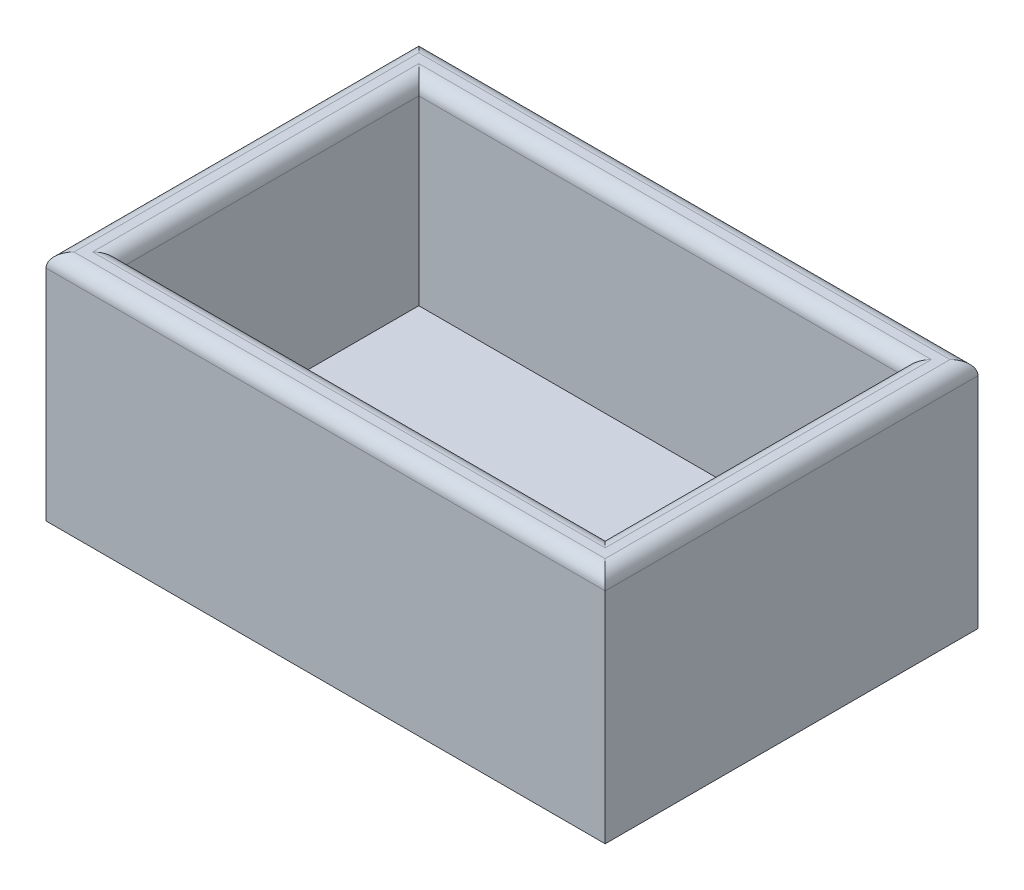
ISO-10303-21;
HEADER;
FILE_DESCRIPTION(('STEP AP214'),'2;1');
FILE_NAME('part.step','',(''),(''),'','','');
FILE_SCHEMA(('AUTOMOTIVE_DESIGN { 1 0 10303 214 1 1 1 1 }'));
ENDSEC;
DATA;
#1=APPLICATION_CONTEXT('core data for automotive mechanical design processes');
#2=APPLICATION_PROTOCOL_DEFINITION('international standard','automotive_design',2000,#1);
#3=PRODUCT_CONTEXT('',#1,'mechanical');
#4=PRODUCT('Part','Part','',(#3));
#5=PRODUCT_RELATED_PRODUCT_CATEGORY('part','',(#4));
#6=PRODUCT_DEFINITION_FORMATION('','',#4);
#7=PRODUCT_DEFINITION_CONTEXT('part definition',#1,'design');
#8=PRODUCT_DEFINITION('design','',#6,#7);
#9=PRODUCT_DEFINITION_SHAPE('','',#8);
#10=(LENGTH_UNIT() NAMED_UNIT(*) SI_UNIT(.MILLI.,.METRE.));
#11=(NAMED_UNIT(*) PLANE_ANGLE_UNIT() SI_UNIT($,.RADIAN.));
#12=(NAMED_UNIT(*) SI_UNIT($,.STERADIAN.) SOLID_ANGLE_UNIT());
#13=UNCERTAINTY_MEASURE_WITH_UNIT(LENGTH_MEASURE(1.E-05),#10,'distance_accuracy_value','');
#14=(GEOMETRIC_REPRESENTATION_CONTEXT(3) GLOBAL_UNCERTAINTY_ASSIGNED_CONTEXT((#13)) GLOBAL_UNIT_ASSIGNED_CONTEXT((#10,
#11,#12)) REPRESENTATION_CONTEXT('',''));
#15=CARTESIAN_POINT('',(0.,0.,0.));
#16=DIRECTION('',(0.,0.,1.));
#17=DIRECTION('',(1.,0.,0.));
#18=AXIS2_PLACEMENT_3D('',#15,#16,#17);
#19=CARTESIAN_POINT('',(-60.,50.,40.));
#20=DIRECTION('',(1.,0.,0.));
#21=DIRECTION('',(0.,0.,-1.));
#22=AXIS2_PLACEMENT_3D('',#19,#20,#21);
#23=PLANE('',#22);
#24=DIRECTION('',(0.,-1.,0.));
#25=VECTOR('',#24,1.);
#26=CARTESIAN_POINT('',(-60.,50.,40.));
#27=LINE('',#26,#25);
#28=CARTESIAN_POINT('',(-60.,47.,40.));
#29=VERTEX_POINT('',#28);
#30=CARTESIAN_POINT('',(-60.,0.,40.));
#31=VERTEX_POINT('',#30);
#32=EDGE_CURVE('E217',#29,#31,#27,.T.);
#33=ORIENTED_EDGE('',*,*,#32,.F.);
#34=DIRECTION('',(0.,0.,1.));
#35=VECTOR('',#34,1.);
#36=CARTESIAN_POINT('',(-60.,47.,40.));
#37=LINE('',#36,#35);
#38=CARTESIAN_POINT('',(-60.,47.,-40.));
#39=VERTEX_POINT('',#38);
#40=EDGE_CURVE('E62',#29,#39,#37,.F.);
#41=ORIENTED_EDGE('',*,*,#40,.T.);
#42=DIRECTION('',(0.,-1.,0.));
#43=VECTOR('',#42,1.);
#44=CARTESIAN_POINT('',(-60.,50.,-40.));
#45=LINE('',#44,#43);
#46=CARTESIAN_POINT('',(-60.,0.,-40.));
#47=VERTEX_POINT('',#46);
#48=EDGE_CURVE('E208',#39,#47,#45,.T.);
#49=ORIENTED_EDGE('',*,*,#48,.T.);
#50=DIRECTION('',(0.,0.,1.));
#51=VECTOR('',#50,1.);
#52=CARTESIAN_POINT('',(-60.,0.,40.));
#53=LINE('',#52,#51);
#54=EDGE_CURVE('E187',#47,#31,#53,.T.);
#55=ORIENTED_EDGE('',*,*,#54,.T.);
#56=EDGE_LOOP('',(#33,#41,#49,#55));
#57=FACE_BOUND('',#56,.T.);
#58=ADVANCED_FACE('F51',(#57),#23,.F.);
#59=CARTESIAN_POINT('',(60.,50.,40.));
#60=DIRECTION('',(0.,0.,-1.));
#61=DIRECTION('',(-1.,0.,0.));
#62=AXIS2_PLACEMENT_3D('',#59,#60,#61);
#63=PLANE('',#62);
#64=DIRECTION('',(0.,-1.,0.));
#65=VECTOR('',#64,1.);
#66=CARTESIAN_POINT('',(60.,50.,40.));
#67=LINE('',#66,#65);
#68=CARTESIAN_POINT('',(60.,47.,40.));
#69=VERTEX_POINT('',#68);
#70=CARTESIAN_POINT('',(60.,0.,40.));
#71=VERTEX_POINT('',#70);
#72=EDGE_CURVE('E214',#69,#71,#67,.T.);
#73=ORIENTED_EDGE('',*,*,#72,.F.);
#74=DIRECTION('',(1.,0.,0.));
#75=VECTOR('',#74,1.);
#76=CARTESIAN_POINT('',(60.,47.,40.));
#77=LINE('',#76,#75);
#78=EDGE_CURVE('E70',#69,#29,#77,.F.);
#79=ORIENTED_EDGE('',*,*,#78,.T.);
#80=ORIENTED_EDGE('',*,*,#32,.T.);
#81=DIRECTION('',(1.,0.,0.));
#82=VECTOR('',#81,1.);
#83=CARTESIAN_POINT('',(60.,0.,40.));
#84=LINE('',#83,#82);
#85=EDGE_CURVE('E197',#31,#71,#84,.T.);
#86=ORIENTED_EDGE('',*,*,#85,.T.);
#87=EDGE_LOOP('',(#73,#79,#80,#86));
#88=FACE_BOUND('',#87,.T.);
#89=ADVANCED_FACE('F323',(#88),#63,.F.);
#90=CARTESIAN_POINT('',(60.,50.,-40.));
#91=DIRECTION('',(-1.,0.,0.));
#92=DIRECTION('',(0.,0.,1.));
#93=AXIS2_PLACEMENT_3D('',#90,#91,#92);
#94=PLANE('',#93);
#95=DIRECTION('',(0.,-1.,0.));
#96=VECTOR('',#95,1.);
#97=CARTESIAN_POINT('',(60.,50.,-40.));
#98=LINE('',#97,#96);
#99=CARTESIAN_POINT('',(60.,47.,-40.));
#100=VERTEX_POINT('',#99);
#101=CARTESIAN_POINT('',(60.,0.,-40.));
#102=VERTEX_POINT('',#101);
#103=EDGE_CURVE('E211',#100,#102,#98,.T.);
#104=ORIENTED_EDGE('',*,*,#103,.F.);
#105=DIRECTION('',(0.,0.,-1.));
#106=VECTOR('',#105,1.);
#107=CARTESIAN_POINT('',(60.,47.,-40.));
#108=LINE('',#107,#106);
#109=EDGE_CURVE('E11',#100,#69,#108,.F.);
#110=ORIENTED_EDGE('',*,*,#109,.T.);
#111=ORIENTED_EDGE('',*,*,#72,.T.);
#112=DIRECTION('',(0.,0.,-1.));
#113=VECTOR('',#112,1.);
#114=CARTESIAN_POINT('',(60.,0.,-40.));
#115=LINE('',#114,#113);
#116=EDGE_CURVE('E201',#71,#102,#115,.T.);
#117=ORIENTED_EDGE('',*,*,#116,.T.);
#118=EDGE_LOOP('',(#104,#110,#111,#117));
#119=FACE_BOUND('',#118,.T.);
#120=ADVANCED_FACE('F318',(#119),#94,.F.);
#121=CARTESIAN_POINT('',(-60.,50.,-40.));
#122=DIRECTION('',(0.,0.,1.));
#123=DIRECTION('',(1.,0.,0.));
#124=AXIS2_PLACEMENT_3D('',#121,#122,#123);
#125=PLANE('',#124);
#126=ORIENTED_EDGE('',*,*,#48,.F.);
#127=DIRECTION('',(-1.,0.,0.));
#128=VECTOR('',#127,1.);
#129=CARTESIAN_POINT('',(-60.,47.,-40.));
#130=LINE('',#129,#128);
#131=EDGE_CURVE('E257',#39,#100,#130,.F.);
#132=ORIENTED_EDGE('',*,*,#131,.T.);
#133=ORIENTED_EDGE('',*,*,#103,.T.);
#134=DIRECTION('',(-1.,0.,0.));
#135=VECTOR('',#134,1.);
#136=CARTESIAN_POINT('',(-60.,0.,-40.));
#137=LINE('',#136,#135);
#138=EDGE_CURVE('E204',#102,#47,#137,.T.);
#139=ORIENTED_EDGE('',*,*,#138,.T.);
#140=EDGE_LOOP('',(#126,#132,#133,#139));
#141=FACE_BOUND('',#140,.T.);
#142=ADVANCED_FACE('F301',(#141),#125,.F.);
#143=CARTESIAN_POINT('',(0.,50.,0.));
#144=DIRECTION('',(0.,-1.,0.));
#145=DIRECTION('',(0.,0.,-1.));
#146=AXIS2_PLACEMENT_3D('',#143,#144,#145);
#147=PLANE('',#146);
#148=DIRECTION('',(1.,0.,0.));
#149=VECTOR('',#148,1.);
#150=CARTESIAN_POINT('',(0.,50.,35.));
#151=LINE('',#150,#149);
#152=CARTESIAN_POINT('',(55.,50.,35.));
#153=VERTEX_POINT('',#152);
#154=CARTESIAN_POINT('',(-55.,50.,35.));
#155=VERTEX_POINT('',#154);
#156=EDGE_CURVE('E240',#153,#155,#151,.F.);
#157=ORIENTED_EDGE('',*,*,#156,.T.);
#158=DIRECTION('',(0.,0.,1.));
#159=VECTOR('',#158,1.);
#160=CARTESIAN_POINT('',(-55.,50.,0.));
#161=LINE('',#160,#159);
#162=CARTESIAN_POINT('',(-55.,50.,-35.));
#163=VERTEX_POINT('',#162);
#164=EDGE_CURVE('E246',#155,#163,#161,.F.);
#165=ORIENTED_EDGE('',*,*,#164,.T.);
#166=DIRECTION('',(-1.,0.,0.));
#167=VECTOR('',#166,1.);
#168=CARTESIAN_POINT('',(0.,50.,-35.));
#169=LINE('',#168,#167);
#170=CARTESIAN_POINT('',(55.,50.,-35.));
#171=VERTEX_POINT('',#170);
#172=EDGE_CURVE('E243',#163,#171,#169,.F.);
#173=ORIENTED_EDGE('',*,*,#172,.T.);
#174=DIRECTION('',(0.,0.,-1.));
#175=VECTOR('',#174,1.);
#176=CARTESIAN_POINT('',(55.,50.,0.));
#177=LINE('',#176,#175);
#178=EDGE_CURVE('E237',#171,#153,#177,.F.);
#179=ORIENTED_EDGE('',*,*,#178,.T.);
#180=EDGE_LOOP('',(#157,#165,#173,#179));
#181=FACE_BOUND('',#180,.T.);
#182=DIRECTION('',(-1.,0.,0.));
#183=VECTOR('',#182,1.);
#184=CARTESIAN_POINT('',(0.,50.,-37.));
#185=LINE('',#184,#183);
#186=CARTESIAN_POINT('',(57.,50.,-37.));
#187=VERTEX_POINT('',#186);
#188=CARTESIAN_POINT('',(-57.,50.,-37.));
#189=VERTEX_POINT('',#188);
#190=EDGE_CURVE('E230',#187,#189,#185,.T.);
#191=ORIENTED_EDGE('',*,*,#190,.T.);
#192=DIRECTION('',(0.,0.,1.));
#193=VECTOR('',#192,1.);
#194=CARTESIAN_POINT('',(-57.,50.,0.));
#195=LINE('',#194,#193);
#196=CARTESIAN_POINT('',(-57.,50.,37.));
#197=VERTEX_POINT('',#196);
#198=EDGE_CURVE('E234',#189,#197,#195,.T.);
#199=ORIENTED_EDGE('',*,*,#198,.T.);
#200=DIRECTION('',(1.,0.,0.));
#201=VECTOR('',#200,1.);
#202=CARTESIAN_POINT('',(0.,50.,37.));
#203=LINE('',#202,#201);
#204=CARTESIAN_POINT('',(57.,50.,37.));
#205=VERTEX_POINT('',#204);
#206=EDGE_CURVE('E227',#197,#205,#203,.T.);
#207=ORIENTED_EDGE('',*,*,#206,.T.);
#208=DIRECTION('',(0.,0.,-1.));
#209=VECTOR('',#208,1.);
#210=CARTESIAN_POINT('',(57.,50.,0.));
#211=LINE('',#210,#209);
#212=EDGE_CURVE('E224',#205,#187,#211,.T.);
#213=ORIENTED_EDGE('',*,*,#212,.T.);
#214=EDGE_LOOP('',(#191,#199,#207,#213));
#215=FACE_BOUND('',#214,.T.);
#216=ADVANCED_FACE('F308',(#181,#215),#147,.F.);
#217=CARTESIAN_POINT('',(0.,0.,0.));
#218=DIRECTION('',(0.,-1.,0.));
#219=DIRECTION('',(0.,0.,-1.));
#220=AXIS2_PLACEMENT_3D('',#217,#218,#219);
#221=PLANE('',#220);
#222=ORIENTED_EDGE('',*,*,#54,.F.);
#223=ORIENTED_EDGE('',*,*,#138,.F.);
#224=ORIENTED_EDGE('',*,*,#116,.F.);
#225=ORIENTED_EDGE('',*,*,#85,.F.);
#226=EDGE_LOOP('',(#222,#223,#224,#225));
#227=FACE_BOUND('',#226,.T.);
#228=ADVANCED_FACE('F310',(#227),#221,.T.);
#229=CARTESIAN_POINT('',(-52.,8.,32.));
#230=DIRECTION('',(-1.,0.,0.));
#231=DIRECTION('',(0.,0.,1.));
#232=AXIS2_PLACEMENT_3D('',#229,#230,#231);
#233=PLANE('',#232);
#234=DIRECTION('',(0.,1.,0.));
#235=VECTOR('',#234,1.);
#236=CARTESIAN_POINT('',(-52.,8.,-32.));
#237=LINE('',#236,#235);
#238=CARTESIAN_POINT('',(-52.,8.,-32.));
#239=VERTEX_POINT('',#238);
#240=CARTESIAN_POINT('',(-52.,47.,-32.));
#241=VERTEX_POINT('',#240);
#242=EDGE_CURVE('E184',#239,#241,#237,.T.);
#243=ORIENTED_EDGE('',*,*,#242,.T.);
#244=DIRECTION('',(0.,0.,1.));
#245=VECTOR('',#244,1.);
#246=CARTESIAN_POINT('',(-52.,47.,32.));
#247=LINE('',#246,#245);
#248=CARTESIAN_POINT('',(-52.,47.,32.));
#249=VERTEX_POINT('',#248);
#250=EDGE_CURVE('E151',#241,#249,#247,.T.);
#251=ORIENTED_EDGE('',*,*,#250,.T.);
#252=DIRECTION('',(0.,1.,0.));
#253=VECTOR('',#252,1.);
#254=CARTESIAN_POINT('',(-52.,8.,32.));
#255=LINE('',#254,#253);
#256=CARTESIAN_POINT('',(-52.,8.,32.));
#257=VERTEX_POINT('',#256);
#258=EDGE_CURVE('E143',#257,#249,#255,.T.);
#259=ORIENTED_EDGE('',*,*,#258,.F.);
#260=DIRECTION('',(0.,0.,1.));
#261=VECTOR('',#260,1.);
#262=CARTESIAN_POINT('',(-52.,8.,32.));
#263=LINE('',#262,#261);
#264=EDGE_CURVE('E148',#239,#257,#263,.T.);
#265=ORIENTED_EDGE('',*,*,#264,.F.);
#266=EDGE_LOOP('',(#243,#251,#259,#265));
#267=FACE_BOUND('',#266,.T.);
#268=ADVANCED_FACE('F146',(#267),#233,.F.);
#269=CARTESIAN_POINT('',(-52.,8.,-32.));
#270=DIRECTION('',(0.,0.,-1.));
#271=DIRECTION('',(-1.,0.,0.));
#272=AXIS2_PLACEMENT_3D('',#269,#270,#271);
#273=PLANE('',#272);
#274=DIRECTION('',(0.,1.,0.));
#275=VECTOR('',#274,1.);
#276=CARTESIAN_POINT('',(52.,8.,-32.));
#277=LINE('',#276,#275);
#278=CARTESIAN_POINT('',(52.,8.,-32.));
#279=VERTEX_POINT('',#278);
#280=CARTESIAN_POINT('',(52.,47.,-32.));
#281=VERTEX_POINT('',#280);
#282=EDGE_CURVE('E188',#279,#281,#277,.T.);
#283=ORIENTED_EDGE('',*,*,#282,.T.);
#284=DIRECTION('',(-1.,0.,0.));
#285=VECTOR('',#284,1.);
#286=CARTESIAN_POINT('',(-52.,47.,-32.));
#287=LINE('',#286,#285);
#288=EDGE_CURVE('E220',#281,#241,#287,.T.);
#289=ORIENTED_EDGE('',*,*,#288,.T.);
#290=ORIENTED_EDGE('',*,*,#242,.F.);
#291=DIRECTION('',(-1.,0.,0.));
#292=VECTOR('',#291,1.);
#293=CARTESIAN_POINT('',(-52.,8.,-32.));
#294=LINE('',#293,#292);
#295=EDGE_CURVE('E156',#279,#239,#294,.T.);
#296=ORIENTED_EDGE('',*,*,#295,.F.);
#297=EDGE_LOOP('',(#283,#289,#290,#296));
#298=FACE_BOUND('',#297,.T.);
#299=ADVANCED_FACE('F384',(#298),#273,.F.);
#300=CARTESIAN_POINT('',(52.,8.,-32.));
#301=DIRECTION('',(1.,0.,0.));
#302=DIRECTION('',(0.,0.,-1.));
#303=AXIS2_PLACEMENT_3D('',#300,#301,#302);
#304=PLANE('',#303);
#305=DIRECTION('',(0.,1.,0.));
#306=VECTOR('',#305,1.);
#307=CARTESIAN_POINT('',(52.,8.,32.));
#308=LINE('',#307,#306);
#309=CARTESIAN_POINT('',(52.,8.,32.));
#310=VERTEX_POINT('',#309);
#311=CARTESIAN_POINT('',(52.,47.,32.));
#312=VERTEX_POINT('',#311);
#313=EDGE_CURVE('E155',#310,#312,#308,.T.);
#314=ORIENTED_EDGE('',*,*,#313,.T.);
#315=DIRECTION('',(0.,0.,-1.));
#316=VECTOR('',#315,1.);
#317=CARTESIAN_POINT('',(52.,47.,-32.));
#318=LINE('',#317,#316);
#319=EDGE_CURVE('E254',#312,#281,#318,.T.);
#320=ORIENTED_EDGE('',*,*,#319,.T.);
#321=ORIENTED_EDGE('',*,*,#282,.F.);
#322=DIRECTION('',(0.,0.,-1.));
#323=VECTOR('',#322,1.);
#324=CARTESIAN_POINT('',(52.,8.,-32.));
#325=LINE('',#324,#323);
#326=EDGE_CURVE('E166',#310,#279,#325,.T.);
#327=ORIENTED_EDGE('',*,*,#326,.F.);
#328=EDGE_LOOP('',(#314,#320,#321,#327));
#329=FACE_BOUND('',#328,.T.);
#330=ADVANCED_FACE('F379',(#329),#304,.F.);
#331=CARTESIAN_POINT('',(52.,8.,32.));
#332=DIRECTION('',(0.,0.,1.));
#333=DIRECTION('',(1.,0.,0.));
#334=AXIS2_PLACEMENT_3D('',#331,#332,#333);
#335=PLANE('',#334);
#336=ORIENTED_EDGE('',*,*,#258,.T.);
#337=DIRECTION('',(1.,0.,0.));
#338=VECTOR('',#337,1.);
#339=CARTESIAN_POINT('',(52.,47.,32.));
#340=LINE('',#339,#338);
#341=EDGE_CURVE('E249',#249,#312,#340,.T.);
#342=ORIENTED_EDGE('',*,*,#341,.T.);
#343=ORIENTED_EDGE('',*,*,#313,.F.);
#344=DIRECTION('',(1.,0.,0.));
#345=VECTOR('',#344,1.);
#346=CARTESIAN_POINT('',(52.,8.,32.));
#347=LINE('',#346,#345);
#348=EDGE_CURVE('E159',#257,#310,#347,.T.);
#349=ORIENTED_EDGE('',*,*,#348,.F.);
#350=EDGE_LOOP('',(#336,#342,#343,#349));
#351=FACE_BOUND('',#350,.T.);
#352=ADVANCED_FACE('F160',(#351),#335,.F.);
#353=CARTESIAN_POINT('',(0.,8.,0.));
#354=DIRECTION('',(0.,-1.,0.));
#355=DIRECTION('',(0.,0.,-1.));
#356=AXIS2_PLACEMENT_3D('',#353,#354,#355);
#357=PLANE('',#356);
#358=ORIENTED_EDGE('',*,*,#264,.T.);
#359=ORIENTED_EDGE('',*,*,#348,.T.);
#360=ORIENTED_EDGE('',*,*,#326,.T.);
#361=ORIENTED_EDGE('',*,*,#295,.T.);
#362=EDGE_LOOP('',(#358,#359,#360,#361));
#363=FACE_BOUND('',#362,.T.);
#364=ADVANCED_FACE('F168',(#363),#357,.F.);
#365=CARTESIAN_POINT('',(52.,47.,35.));
#366=DIRECTION('',(1.,0.,0.));
#367=DIRECTION('',(0.,0.,-1.));
#368=AXIS2_PLACEMENT_3D('',#365,#366,#367);
#369=CYLINDRICAL_SURFACE('',#368,3.);
#370=CARTESIAN_POINT('',(-55.,47.,35.));
#371=DIRECTION('',(0.707106781186547,0.,0.707106781186547));
#372=DIRECTION('',(0.707106781186547,0.,-0.707106781186547));
#373=AXIS2_PLACEMENT_3D('',#370,#371,#372);
#374=ELLIPSE('',#373,4.24264068711928,3.);
#375=EDGE_CURVE('E177',#155,#249,#374,.F.);
#376=ORIENTED_EDGE('',*,*,#375,.F.);
#377=ORIENTED_EDGE('',*,*,#156,.F.);
#378=CARTESIAN_POINT('',(55.,47.,35.));
#379=DIRECTION('',(0.707106781186547,0.,-0.707106781186547));
#380=DIRECTION('',(0.707106781186547,0.,0.707106781186547));
#381=AXIS2_PLACEMENT_3D('',#378,#379,#380);
#382=ELLIPSE('',#381,4.24264068711928,3.);
#383=EDGE_CURVE('E171',#312,#153,#382,.T.);
#384=ORIENTED_EDGE('',*,*,#383,.F.);
#385=ORIENTED_EDGE('',*,*,#341,.F.);
#386=EDGE_LOOP('',(#376,#377,#384,#385));
#387=FACE_BOUND('',#386,.T.);
#388=ADVANCED_FACE('F347',(#387),#369,.T.);
#389=CARTESIAN_POINT('',(55.,47.,-32.));
#390=DIRECTION('',(0.,0.,-1.));
#391=DIRECTION('',(-1.,0.,0.));
#392=AXIS2_PLACEMENT_3D('',#389,#390,#391);
#393=CYLINDRICAL_SURFACE('',#392,3.);
#394=ORIENTED_EDGE('',*,*,#383,.T.);
#395=ORIENTED_EDGE('',*,*,#178,.F.);
#396=CARTESIAN_POINT('',(55.,47.,-35.));
#397=DIRECTION('',(-0.707106781186547,0.,-0.707106781186547));
#398=DIRECTION('',(-0.707106781186547,0.,0.707106781186547));
#399=AXIS2_PLACEMENT_3D('',#396,#397,#398);
#400=ELLIPSE('',#399,4.24264068711928,3.);
#401=EDGE_CURVE('E268',#281,#171,#400,.T.);
#402=ORIENTED_EDGE('',*,*,#401,.F.);
#403=ORIENTED_EDGE('',*,*,#319,.F.);
#404=EDGE_LOOP('',(#394,#395,#402,#403));
#405=FACE_BOUND('',#404,.T.);
#406=ADVANCED_FACE('F342',(#405),#393,.T.);
#407=CARTESIAN_POINT('',(-55.,47.,32.));
#408=DIRECTION('',(0.,0.,1.));
#409=DIRECTION('',(1.,0.,0.));
#410=AXIS2_PLACEMENT_3D('',#407,#408,#409);
#411=CYLINDRICAL_SURFACE('',#410,3.);
#412=ORIENTED_EDGE('',*,*,#375,.T.);
#413=ORIENTED_EDGE('',*,*,#250,.F.);
#414=CARTESIAN_POINT('',(-55.,47.,-35.));
#415=DIRECTION('',(-0.707106781186547,0.,0.707106781186547));
#416=DIRECTION('',(-0.707106781186547,0.,-0.707106781186547));
#417=AXIS2_PLACEMENT_3D('',#414,#415,#416);
#418=ELLIPSE('',#417,4.24264068711928,3.);
#419=EDGE_CURVE('E265',#163,#241,#418,.F.);
#420=ORIENTED_EDGE('',*,*,#419,.F.);
#421=ORIENTED_EDGE('',*,*,#164,.F.);
#422=EDGE_LOOP('',(#412,#413,#420,#421));
#423=FACE_BOUND('',#422,.T.);
#424=ADVANCED_FACE('F337',(#423),#411,.T.);
#425=CARTESIAN_POINT('',(-52.,47.,-35.));
#426=DIRECTION('',(-1.,0.,0.));
#427=DIRECTION('',(0.,0.,1.));
#428=AXIS2_PLACEMENT_3D('',#425,#426,#427);
#429=CYLINDRICAL_SURFACE('',#428,3.);
#430=ORIENTED_EDGE('',*,*,#401,.T.);
#431=ORIENTED_EDGE('',*,*,#172,.F.);
#432=ORIENTED_EDGE('',*,*,#419,.T.);
#433=ORIENTED_EDGE('',*,*,#288,.F.);
#434=EDGE_LOOP('',(#430,#431,#432,#433));
#435=FACE_BOUND('',#434,.T.);
#436=ADVANCED_FACE('F333',(#435),#429,.T.);
#437=CARTESIAN_POINT('',(0.,47.,37.));
#438=DIRECTION('',(1.,0.,0.));
#439=DIRECTION('',(0.,0.,-1.));
#440=AXIS2_PLACEMENT_3D('',#437,#438,#439);
#441=CYLINDRICAL_SURFACE('',#440,3.);
#442=CARTESIAN_POINT('',(-57.,47.,37.));
#443=DIRECTION('',(0.707106781186547,0.,0.707106781186547));
#444=DIRECTION('',(-0.707106781186547,0.,0.707106781186547));
#445=AXIS2_PLACEMENT_3D('',#442,#443,#444);
#446=ELLIPSE('',#445,4.24264068711928,3.);
#447=EDGE_CURVE('E279',#29,#197,#446,.F.);
#448=ORIENTED_EDGE('',*,*,#447,.F.);
#449=ORIENTED_EDGE('',*,*,#78,.F.);
#450=CARTESIAN_POINT('',(57.,47.,37.));
#451=DIRECTION('',(0.707106781186547,0.,-0.707106781186547));
#452=DIRECTION('',(-0.707106781186547,0.,-0.707106781186547));
#453=AXIS2_PLACEMENT_3D('',#450,#451,#452);
#454=ELLIPSE('',#453,4.24264068711928,3.);
#455=EDGE_CURVE('E56',#205,#69,#454,.T.);
#456=ORIENTED_EDGE('',*,*,#455,.F.);
#457=ORIENTED_EDGE('',*,*,#206,.F.);
#458=EDGE_LOOP('',(#448,#449,#456,#457));
#459=FACE_BOUND('',#458,.T.);
#460=ADVANCED_FACE('F54',(#459),#441,.T.);
#461=CARTESIAN_POINT('',(57.,47.,0.));
#462=DIRECTION('',(0.,0.,-1.));
#463=DIRECTION('',(-1.,0.,0.));
#464=AXIS2_PLACEMENT_3D('',#461,#462,#463);
#465=CYLINDRICAL_SURFACE('',#464,3.);
#466=ORIENTED_EDGE('',*,*,#455,.T.);
#467=ORIENTED_EDGE('',*,*,#109,.F.);
#468=CARTESIAN_POINT('',(57.,47.,-37.));
#469=DIRECTION('',(-0.707106781186547,0.,-0.707106781186547));
#470=DIRECTION('',(0.707106781186547,0.,-0.707106781186547));
#471=AXIS2_PLACEMENT_3D('',#468,#469,#470);
#472=ELLIPSE('',#471,4.24264068711928,3.);
#473=EDGE_CURVE('E277',#187,#100,#472,.T.);
#474=ORIENTED_EDGE('',*,*,#473,.F.);
#475=ORIENTED_EDGE('',*,*,#212,.F.);
#476=EDGE_LOOP('',(#466,#467,#474,#475));
#477=FACE_BOUND('',#476,.T.);
#478=ADVANCED_FACE('F291',(#477),#465,.T.);
#479=CARTESIAN_POINT('',(-57.,47.,0.));
#480=DIRECTION('',(0.,0.,1.));
#481=DIRECTION('',(1.,0.,0.));
#482=AXIS2_PLACEMENT_3D('',#479,#480,#481);
#483=CYLINDRICAL_SURFACE('',#482,3.);
#484=ORIENTED_EDGE('',*,*,#447,.T.);
#485=ORIENTED_EDGE('',*,*,#198,.F.);
#486=CARTESIAN_POINT('',(-57.,47.,-37.));
#487=DIRECTION('',(-0.707106781186547,0.,0.707106781186547));
#488=DIRECTION('',(0.707106781186547,0.,0.707106781186547));
#489=AXIS2_PLACEMENT_3D('',#486,#487,#488);
#490=ELLIPSE('',#489,4.24264068711928,3.);
#491=EDGE_CURVE('E274',#39,#189,#490,.F.);
#492=ORIENTED_EDGE('',*,*,#491,.F.);
#493=ORIENTED_EDGE('',*,*,#40,.F.);
#494=EDGE_LOOP('',(#484,#485,#492,#493));
#495=FACE_BOUND('',#494,.T.);
#496=ADVANCED_FACE('F296',(#495),#483,.T.);
#497=CARTESIAN_POINT('',(0.,47.,-37.));
#498=DIRECTION('',(-1.,0.,0.));
#499=DIRECTION('',(0.,0.,1.));
#500=AXIS2_PLACEMENT_3D('',#497,#498,#499);
#501=CYLINDRICAL_SURFACE('',#500,3.);
#502=ORIENTED_EDGE('',*,*,#473,.T.);
#503=ORIENTED_EDGE('',*,*,#131,.F.);
#504=ORIENTED_EDGE('',*,*,#491,.T.);
#505=ORIENTED_EDGE('',*,*,#190,.F.);
#506=EDGE_LOOP('',(#502,#503,#504,#505));
#507=FACE_BOUND('',#506,.T.);
#508=ADVANCED_FACE('F305',(#507),#501,.T.);
#509=CLOSED_SHELL('',(#58,#89,#120,#142,#216,#228,#268,#299,#330,#352,#364,#388,#406,#424,#436,
#460,#478,#496,#508));
#510=MANIFOLD_SOLID_BREP('B2',#509);
#511=ADVANCED_BREP_SHAPE_REPRESENTATION('',(#18,#510),#14);
#512=SHAPE_DEFINITION_REPRESENTATION(#9,#511);
ENDSEC;
END-ISO-10303-21;
